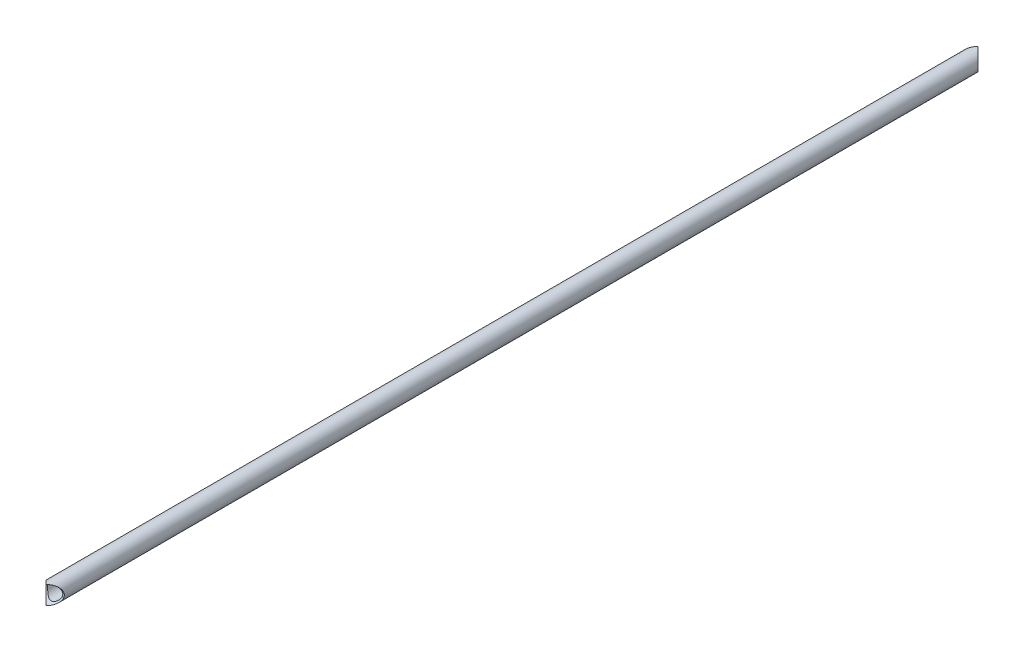
ISO-10303-21;
HEADER;
FILE_DESCRIPTION(('STEP AP214'),'2;1');
FILE_NAME('part.step','',(''),(''),'','','');
FILE_SCHEMA(('AUTOMOTIVE_DESIGN { 1 0 10303 214 1 1 1 1 }'));
ENDSEC;
DATA;
#1=APPLICATION_CONTEXT('core data for automotive mechanical design processes');
#2=APPLICATION_PROTOCOL_DEFINITION('international standard','automotive_design',2000,#1);
#3=PRODUCT_CONTEXT('',#1,'mechanical');
#4=PRODUCT('Part','Part','',(#3));
#5=PRODUCT_RELATED_PRODUCT_CATEGORY('part','',(#4));
#6=PRODUCT_DEFINITION_FORMATION('','',#4);
#7=PRODUCT_DEFINITION_CONTEXT('part definition',#1,'design');
#8=PRODUCT_DEFINITION('design','',#6,#7);
#9=PRODUCT_DEFINITION_SHAPE('','',#8);
#10=(LENGTH_UNIT() NAMED_UNIT(*) SI_UNIT(.MILLI.,.METRE.));
#11=(NAMED_UNIT(*) PLANE_ANGLE_UNIT() SI_UNIT($,.RADIAN.));
#12=(NAMED_UNIT(*) SI_UNIT($,.STERADIAN.) SOLID_ANGLE_UNIT());
#13=UNCERTAINTY_MEASURE_WITH_UNIT(LENGTH_MEASURE(1.E-05),#10,'distance_accuracy_value','');
#14=(GEOMETRIC_REPRESENTATION_CONTEXT(3) GLOBAL_UNCERTAINTY_ASSIGNED_CONTEXT((#13)) GLOBAL_UNIT_ASSIGNED_CONTEXT((#10,
#11,#12)) REPRESENTATION_CONTEXT('',''));
#15=CARTESIAN_POINT('',(0.,0.,0.));
#16=DIRECTION('',(0.,0.,1.));
#17=DIRECTION('',(1.,0.,0.));
#18=AXIS2_PLACEMENT_3D('',#15,#16,#17);
#19=CARTESIAN_POINT('',(-203.2,0.,2143.252));
#20=DIRECTION('',(-1.,0.,0.));
#21=DIRECTION('',(0.,0.,1.));
#22=AXIS2_PLACEMENT_3D('',#19,#20,#21);
#23=CYLINDRICAL_SURFACE('',#22,21.082);
#24=CARTESIAN_POINT('',(0.,0.,2143.252));
#25=DIRECTION('',(-0.707106781186549,0.,-0.707106781186546));
#26=DIRECTION('',(0.707106781186546,0.,-0.707106781186549));
#27=AXIS2_PLACEMENT_3D('',#24,#25,#26);
#28=ELLIPSE('',#27,29.8144503219495,21.082);
#29=CARTESIAN_POINT('',(0.,21.082,2143.252));
#30=VERTEX_POINT('',#29);
#31=CARTESIAN_POINT('',(0.,-21.082,2143.252));
#32=VERTEX_POINT('',#31);
#33=EDGE_CURVE('E36',#30,#32,#28,.T.);
#34=ORIENTED_EDGE('',*,*,#33,.F.);
#35=CARTESIAN_POINT('',(0.,0.,2143.252));
#36=DIRECTION('',(0.707106781186549,0.,-0.707106781186546));
#37=DIRECTION('',(-0.707106781186546,0.,-0.707106781186549));
#38=AXIS2_PLACEMENT_3D('',#35,#36,#37);
#39=ELLIPSE('',#38,29.8144503219495,21.082);
#40=EDGE_CURVE('E49',#32,#30,#39,.T.);
#41=ORIENTED_EDGE('',*,*,#40,.F.);
#42=EDGE_LOOP('',(#34,#41));
#43=FACE_BOUND('',#42,.T.);
#44=CARTESIAN_POINT('',(0.,-17.526,2131.53491640381));
#45=CARTESIAN_POINT('',(-0.311185239624755,-17.5260016378947,2131.53492057647));
#46=CARTESIAN_POINT('',(-0.622351445218545,-17.5176931015294,2131.52246304469));
#47=CARTESIAN_POINT('',(-1.24185385401228,-17.4846988539183,2131.47333724735));
#48=CARTESIAN_POINT('',(-1.55019015908706,-17.4600137345834,2131.43666985684));
#49=CARTESIAN_POINT('',(-2.16244529665251,-17.3948143787621,2131.34089229361));
#50=CARTESIAN_POINT('',(-2.46635032751227,-17.3542585500645,2131.28172316238));
#51=CARTESIAN_POINT('',(-3.06720718463186,-17.2582022882152,2131.14364625518));
#52=CARTESIAN_POINT('',(-3.36415774479987,-17.2026991564801,2131.06473491513));
#53=CARTESIAN_POINT('',(-4.06302745628092,-17.0535843130683,2130.85651458388));
#54=CARTESIAN_POINT('',(-4.46127907530082,-16.9535301925097,2130.71950458714));
#55=CARTESIAN_POINT('',(-5.2413407073691,-16.7288372054572,2130.42111585758));
#56=CARTESIAN_POINT('',(-5.62314297747671,-16.6041869119638,2130.25972580635));
#57=CARTESIAN_POINT('',(-6.37126683424926,-16.3317636320621,2129.9188861052));
#58=CARTESIAN_POINT('',(-6.73754662963654,-16.1839327090338,2129.73939161807));
#59=CARTESIAN_POINT('',(-7.45408327588804,-15.8666576854035,2129.36821169555));
#60=CARTESIAN_POINT('',(-7.80434067708931,-15.6972143279039,2129.17652667941));
#61=CARTESIAN_POINT('',(-8.64017899381091,-15.2583916209032,2128.69939510194));
#62=CARTESIAN_POINT('',(-9.11754391622324,-14.9778300302295,2128.40978137055));
#63=CARTESIAN_POINT('',(-10.0415160632166,-14.374735865823,2127.82493103364));
#64=CARTESIAN_POINT('',(-10.4881101794548,-14.0521855719282,2127.52969209931));
#65=CARTESIAN_POINT('',(-11.3497898907657,-13.3658527392674,2126.94222911673));
#66=CARTESIAN_POINT('',(-11.7649018003025,-13.0021052837984,2126.65000273099));
#67=CARTESIAN_POINT('',(-12.5623875794974,-12.2333003114351,2126.07564324607));
#68=CARTESIAN_POINT('',(-12.944773718712,-11.8282584025824,2125.79350638742));
#69=CARTESIAN_POINT('',(-13.5970346278617,-11.0669192234584,2125.30392467813));
#70=CARTESIAN_POINT('',(-13.8736134382399,-10.7183987975036,2125.09329140114));
#71=CARTESIAN_POINT('',(-14.4028407038531,-9.99596445975405,2124.6858117188));
#72=CARTESIAN_POINT('',(-14.6554900987945,-9.62205154611154,2124.48896477215));
#73=CARTESIAN_POINT('',(-15.1342035654355,-8.8500045327916,2124.11271286466));
#74=CARTESIAN_POINT('',(-15.3603025729126,-8.45190333226421,2123.93328503838));
#75=CARTESIAN_POINT('',(-15.7836038697298,-7.63224400398995,2123.59504177298));
#76=CARTESIAN_POINT('',(-15.9808113730435,-7.21069012767892,2123.43622261526));
#77=CARTESIAN_POINT('',(-16.3122154450185,-6.42051007803403,2123.16790984207));
#78=CARTESIAN_POINT('',(-16.4514151662288,-6.0552618741211,2123.05463133381));
#79=CARTESIAN_POINT('',(-16.7063464821851,-5.31159989558663,2122.84644574757));
#80=CARTESIAN_POINT('',(-16.8220825094071,-4.93318862342567,2122.75153519989));
#81=CARTESIAN_POINT('',(-17.0284767212217,-4.16529168273308,2122.58183750101));
#82=CARTESIAN_POINT('',(-17.1191435267946,-3.77580987215476,2122.50704343225));
#83=CARTESIAN_POINT('',(-17.2740554751118,-2.98810662755946,2122.37902377929));
#84=CARTESIAN_POINT('',(-17.3383003130948,-2.58988509279093,2122.32579844386));
#85=CARTESIAN_POINT('',(-17.4394973865413,-1.78589985576373,2122.24187595641));
#86=CARTESIAN_POINT('',(-17.4763337840664,-1.38011148961259,2122.21127442415));
#87=CARTESIAN_POINT('',(-17.5216078754302,-0.565854491198933,2122.17365492607));
#88=CARTESIAN_POINT('',(-17.5300455100714,-0.15738585335114,2122.1666370094));
#89=CARTESIAN_POINT('',(-17.5183673988472,0.658840305394934,2122.17634498303));
#90=CARTESIAN_POINT('',(-17.4982527387285,1.06659785274323,2122.19306997046));
#91=CARTESIAN_POINT('',(-17.4298388579758,1.87807893983295,2122.24988184256));
#92=CARTESIAN_POINT('',(-17.3815405868964,2.28180261501641,2122.28996794014));
#93=CARTESIAN_POINT('',(-17.2617419142674,3.05546264031595,2122.38919245349));
#94=CARTESIAN_POINT('',(-17.1919987114047,3.42586003012301,2122.44688606791));
#95=CARTESIAN_POINT('',(-17.0297069941817,4.15817336909846,2122.58079136849));
#96=CARTESIAN_POINT('',(-16.937159708176,4.5200897739503,2122.65700205721));
#97=CARTESIAN_POINT('',(-16.7304558932916,5.23359484929578,2122.82665503481));
#98=CARTESIAN_POINT('',(-16.6162960800062,5.58518194067378,2122.92009994268));
#99=CARTESIAN_POINT('',(-16.3677116370536,6.27643426134686,2123.12274637778));
#100=CARTESIAN_POINT('',(-16.2332858135048,6.61609878682287,2123.23194883328));
#101=CARTESIAN_POINT('',(-15.9331108592373,7.31109089686555,2123.4745988316));
#102=CARTESIAN_POINT('',(-15.765658679436,7.66523513049864,2123.60932608995));
#103=CARTESIAN_POINT('',(-15.4101996598829,8.35689209437833,2123.89346450325));
#104=CARTESIAN_POINT('',(-15.2221918600498,8.69440404672015,2124.04287634403));
#105=CARTESIAN_POINT('',(-14.8272083285566,9.35209844960755,2124.35434415863));
#106=CARTESIAN_POINT('',(-14.6202293775807,9.67227794419838,2124.51640227776));
#107=CARTESIAN_POINT('',(-14.1887580520627,10.2948186721717,2124.85112038901));
#108=CARTESIAN_POINT('',(-13.9642632148072,10.5971773894447,2125.02378187121));
#109=CARTESIAN_POINT('',(-13.4507289160126,11.2446849710491,2125.41443120589));
#110=CARTESIAN_POINT('',(-13.1579624545573,11.585694058529,2125.63439002879));
#111=CARTESIAN_POINT('',(-12.5504633562742,12.2411720036755,2126.08335766278));
#112=CARTESIAN_POINT('',(-12.2357274740967,12.5556369249829,2126.31236780877));
#113=CARTESIAN_POINT('',(-11.5850519846572,13.1584286905595,2126.77622069024));
#114=CARTESIAN_POINT('',(-11.2490806325735,13.4467147540311,2127.01107182361));
#115=CARTESIAN_POINT('',(-10.557107915642,13.9965511777058,2127.48246034144));
#116=CARTESIAN_POINT('',(-10.2011079065655,14.2581033442005,2127.71899761081));
#117=CARTESIAN_POINT('',(-9.4652181055698,14.7570366580728,2128.19211825249));
#118=CARTESIAN_POINT('',(-9.08510932065595,14.9941216137859,2128.42867374105));
#119=CARTESIAN_POINT('',(-8.30410846278523,15.4403622641035,2128.89408078949));
#120=CARTESIAN_POINT('',(-7.90321133245431,15.64951111776,2129.12293045216));
#121=CARTESIAN_POINT('',(-7.08063883642226,16.0384509266286,2129.56603839884));
#122=CARTESIAN_POINT('',(-6.65899996365621,16.2182912005025,2129.7803208339));
#123=CARTESIAN_POINT('',(-5.79353295482928,16.54719564434,2130.18642670967));
#124=CARTESIAN_POINT('',(-5.34971973229005,16.696280162227,2130.37826496278));
#125=CARTESIAN_POINT('',(-4.61599174217163,16.9096872269796,2130.66107392337));
#126=CARTESIAN_POINT('',(-4.33305990670602,16.9844727479109,2130.76233081244));
#127=CARTESIAN_POINT('',(-3.75910386380256,17.1206528131974,2130.94966833095));
#128=CARTESIAN_POINT('',(-3.46808258489758,17.1820521342226,2131.03575437178));
#129=CARTESIAN_POINT('',(-2.87925352198589,17.2904590721008,2131.18967756837));
#130=CARTESIAN_POINT('',(-2.58146156719823,17.3374971591084,2131.25755332314));
#131=CARTESIAN_POINT('',(-1.97986154206133,17.4164527674171,2131.3724888877));
#132=CARTESIAN_POINT('',(-1.67605364299667,17.4483707185722,2131.41954928924));
#133=CARTESIAN_POINT('',(-1.06142244679823,17.4965707933311,2131.49093551047));
#134=CARTESIAN_POINT('',(-0.750559438662828,17.5126944221406,2131.51503081352));
#135=CARTESIAN_POINT('',(-0.127486752535073,17.5283064038534,2131.5383581686));
#136=CARTESIAN_POINT('',(0.184722851397935,17.5277956602287,2131.53759157097));
#137=CARTESIAN_POINT('',(0.807835261309535,17.5101485211154,2131.51123067379));
#138=CARTESIAN_POINT('',(1.11873693105044,17.4929998394571,2131.48561802685));
#139=CARTESIAN_POINT('',(1.73636752581673,17.4425276727906,2131.41092947355));
#140=CARTESIAN_POINT('',(2.04309580438809,17.4092017106118,2131.36184997381));
#141=CARTESIAN_POINT('',(2.70129580173789,17.3202684324222,2131.23259244201));
#142=CARTESIAN_POINT('',(3.05163094171097,17.2618591297115,2131.14857598413));
#143=CARTESIAN_POINT('',(3.74168673817621,17.125544653635,2130.9564618039));
#144=CARTESIAN_POINT('',(4.08140475984641,17.0476346833835,2130.84835815718));
#145=CARTESIAN_POINT('',(4.75017183758834,16.8735380534471,2130.61254027511));
#146=CARTESIAN_POINT('',(5.07918889906025,16.7773015999041,2130.48477279803));
#147=CARTESIAN_POINT('',(5.72537291471272,16.5679251651736,2130.21421319313));
#148=CARTESIAN_POINT('',(6.04253907635785,16.4547840559982,2130.07142006289));
#149=CARTESIAN_POINT('',(6.84649854955802,16.1420461654977,2129.6882015848));
#150=CARTESIAN_POINT('',(7.32461540499281,15.9304484628452,2129.43931063567));
#151=CARTESIAN_POINT('',(8.25327584896681,15.4697427495779,2128.92519953056));
#152=CARTESIAN_POINT('',(8.70380408430281,15.2206141148922,2128.65997044409));
#153=CARTESIAN_POINT('',(9.57870297739579,14.6857838585868,2128.12181132487));
#154=CARTESIAN_POINT('',(10.0030396349771,14.4000361208072,2127.84887192597));
#155=CARTESIAN_POINT('',(10.8250002111717,13.7927902751819,2127.30281658318));
#156=CARTESIAN_POINT('',(11.2226293616248,13.4712992021975,2127.02970068452));
#157=CARTESIAN_POINT('',(12.0048882555962,12.7799006234573,2126.47918351307));
#158=CARTESIAN_POINT('',(12.3884749126378,12.4086316211082,2126.2020042632));
#159=CARTESIAN_POINT('',(13.1242664808958,11.6276478455587,2125.66011118268));
#160=CARTESIAN_POINT('',(13.4764660278002,11.2179265250181,2125.39539948646));
#161=CARTESIAN_POINT('',(14.1456465541962,10.3612672323298,2124.88510958517));
#162=CARTESIAN_POINT('',(14.4627101247532,9.91442105137353,2124.63948693374));
#163=CARTESIAN_POINT('',(14.9093724844699,9.21669876910963,2124.28964453539));
#164=CARTESIAN_POINT('',(15.0534199394609,8.97958368951592,2124.17614333907));
#165=CARTESIAN_POINT('',(15.3313920219187,8.4962827002655,2123.95603119063));
#166=CARTESIAN_POINT('',(15.4653142538036,8.25009466435488,2123.84942186994));
#167=CARTESIAN_POINT('',(15.7740353493856,7.64828647045894,2123.60261035176));
#168=CARTESIAN_POINT('',(15.9436374285181,7.28844211338054,2123.466122028));
#169=CARTESIAN_POINT('',(16.2597758929263,6.55290444190038,2123.21050018297));
#170=CARTESIAN_POINT('',(16.4063182437831,6.17721525857145,2123.09136217375));
#171=CARTESIAN_POINT('',(16.6744852599454,5.41170805813631,2122.87253727829));
#172=CARTESIAN_POINT('',(16.7961216056682,5.02189676543445,2122.7728412752));
#173=CARTESIAN_POINT('',(17.012789133161,4.23014401773285,2122.5947680549));
#174=CARTESIAN_POINT('',(17.1078196373129,3.82820225407366,2122.51639138068));
#175=CARTESIAN_POINT('',(17.2702087031939,3.01240280049619,2122.38221204066));
#176=CARTESIAN_POINT('',(17.3373944048852,2.59848725210803,2122.32655042127));
#177=CARTESIAN_POINT('',(17.4420303309739,1.7643465795862,2122.23977466753));
#178=CARTESIAN_POINT('',(17.4794806014798,1.34412146523731,2122.2086604951));
#179=CARTESIAN_POINT('',(17.5239199181906,0.501049558003906,2122.1717328222));
#180=CARTESIAN_POINT('',(17.5309162037693,0.0782034121150402,2122.1659133088));
#181=CARTESIAN_POINT('',(17.5143262226543,-0.766452841317653,2122.17970426579));
#182=CARTESIAN_POINT('',(17.4907419935961,-1.18826301601389,2122.19931304185));
#183=CARTESIAN_POINT('',(17.4170841881761,-1.98788490913943,2122.26046601728));
#184=CARTESIAN_POINT('',(17.3696960042557,-2.36612013468839,2122.29978579211));
#185=CARTESIAN_POINT('',(17.2509229834361,-3.11616450871018,2122.39814465942));
#186=CARTESIAN_POINT('',(17.1795399537179,-3.48797413891253,2122.45718226685));
#187=CARTESIAN_POINT('',(17.013794690207,-4.22296419237839,2122.59390075403));
#188=CARTESIAN_POINT('',(16.9194295314404,-4.58614351078497,2122.67158400683));
#189=CARTESIAN_POINT('',(16.7089637385301,-5.30192354415775,2122.84425885089));
#190=CARTESIAN_POINT('',(16.5928618601162,-5.65452365219928,2122.93925143297));
#191=CARTESIAN_POINT('',(16.3343025519062,-6.36399761707243,2123.14992039785));
#192=CARTESIAN_POINT('',(16.190857241763,-6.72028282825502,2123.26636337183));
#193=CARTESIAN_POINT('',(15.883236030154,-7.41814865422428,2123.51475089192));
#194=CARTESIAN_POINT('',(15.7190600747583,-7.75972923075431,2123.64669547837));
#195=CARTESIAN_POINT('',(15.3715416074323,-8.42721585313437,2123.92421185115));
#196=CARTESIAN_POINT('',(15.1881989812049,-8.7531218054946,2124.06978371874));
#197=CARTESIAN_POINT('',(14.8037894086192,-9.38863490224759,2124.37269293314));
#198=CARTESIAN_POINT('',(14.6027189316966,-9.69823878032626,2124.53003262259));
#199=CARTESIAN_POINT('',(14.0863757170533,-10.4414710002705,2124.9304731098));
#200=CARTESIAN_POINT('',(13.7616297139404,-10.8654797714761,2125.17930369519));
#201=CARTESIAN_POINT('',(13.0802149259049,-11.6768821386592,2125.69262064775));
#202=CARTESIAN_POINT('',(12.7235334230057,-12.0642610197643,2125.95711323782));
#203=CARTESIAN_POINT('',(11.9792953739003,-12.8036491868348,2126.49707118441));
#204=CARTESIAN_POINT('',(11.5916199606554,-13.1555093209754,2126.77257653929));
#205=CARTESIAN_POINT('',(10.7882226138889,-13.8219877892587,2127.32744923368));
#206=CARTESIAN_POINT('',(10.3725051599322,-14.1366120496172,2127.60681595072));
#207=CARTESIAN_POINT('',(9.50576680677194,-14.7337377450352,2128.16762418421));
#208=CARTESIAN_POINT('',(9.05424836320273,-15.0155658912321,2128.44901378704));
#209=CARTESIAN_POINT('',(8.12162517178224,-15.5398276170172,2129.00036827842));
#210=CARTESIAN_POINT('',(7.64050505920284,-15.782240496263,2129.270327109));
#211=CARTESIAN_POINT('',(6.89707752392845,-16.1140950182193,2129.65731316698));
#212=CARTESIAN_POINT('',(6.64623211980605,-16.2192180576644,2129.78305372928));
#213=CARTESIAN_POINT('',(6.13676732769517,-16.418760267264,2130.0270281082));
#214=CARTESIAN_POINT('',(5.87814733892529,-16.5131786075084,2130.14526134248));
#215=CARTESIAN_POINT('',(5.0909372652079,-16.7794342334219,2130.48548685745));
#216=CARTESIAN_POINT('',(4.55013693174708,-16.9346599661885,2130.69346683059));
#217=CARTESIAN_POINT('',(3.67633247278741,-17.1391936180727,2130.97539498441));
#218=CARTESIAN_POINT('',(3.35339503807153,-17.2054060883421,2131.06862094069));
#219=CARTESIAN_POINT('',(2.69865889204712,-17.3201691751224,2131.23233072331));
#220=CARTESIAN_POINT('',(2.3668620364875,-17.3687234597522,2131.30281927254));
#221=CARTESIAN_POINT('',(1.69770604668934,-17.4468189322611,2131.4171334776));
#222=CARTESIAN_POINT('',(1.36037183699502,-17.476429342286,2131.46105617427));
#223=CARTESIAN_POINT('',(0.68201714686959,-17.5160177178801,2131.51994349138));
#224=CARTESIAN_POINT('',(0.340997145591274,-17.5259982051931,2131.53491183142));
#225=CARTESIAN_POINT('',(0.,-17.526,2131.53491640381));
#226=B_SPLINE_CURVE_WITH_KNOTS('',3,(#44,#45,#46,#47,#48,#49,#50,#51,#52,#53,#54,#55,#56,#57,
#58,#59,#60,#61,#62,#63,#64,#65,#66,#67,#68,#69,#70,#71,#72,#73,#74,#75,#76,#77,#78,#79,#80,#81,
#82,#83,#84,#85,#86,#87,#88,#89,#90,#91,#92,#93,#94,#95,#96,#97,#98,#99,#100,#101,#102,#103,
#104,#105,#106,#107,#108,#109,#110,#111,#112,#113,#114,#115,#116,#117,#118,#119,#120,#121,#122,
#123,#124,#125,#126,#127,#128,#129,#130,#131,#132,#133,#134,#135,#136,#137,#138,#139,#140,#141,
#142,#143,#144,#145,#146,#147,#148,#149,#150,#151,#152,#153,#154,#155,#156,#157,#158,#159,#160,
#161,#162,#163,#164,#165,#166,#167,#168,#169,#170,#171,#172,#173,#174,#175,#176,#177,#178,#179,
#180,#181,#182,#183,#184,#185,#186,#187,#188,#189,#190,#191,#192,#193,#194,#195,#196,#197,#198,
#199,#200,#201,#202,#203,#204,#205,#206,#207,#208,#209,#210,#211,#212,#213,#214,#215,#216,#217,
#218,#219,#220,#221,#222,#223,#224,#225),.UNSPECIFIED.,.T.,.F.,(4,2,2,2,2,2,2,2,2,2,2,2,2,2,2,2,
2,2,2,2,2,2,2,2,2,2,2,2,2,2,2,2,2,2,2,2,2,2,2,2,2,2,2,2,2,2,2,2,2,2,2,2,2,2,2,2,2,2,2,2,2,2,2,2,
2,2,2,2,2,2,2,2,2,2,2,2,2,2,2,2,2,2,2,2,2,2,2,2,2,2,4),(0.,0.933172693022033,1.86631165953256,
2.80191264993146,3.73768266693524,5.03421487261744,6.33135085124964,7.63178208439832,
8.93216861675461,10.8043377121157,12.6772994813248,14.5486780714613,16.4193519416872,
17.8948685619842,19.3703272147969,20.8438221291614,22.3170507973488,23.53671968528,
24.7561579530498,25.9751763487712,27.1942088047281,28.4183645138435,29.6425227747186,
30.8666344862649,32.0907049577554,33.2333470618128,34.3759276302669,35.518681973679,
36.6615036636896,37.9030932180036,39.1447407874231,40.3865994501213,41.6286330324569,
43.1283930869268,44.6283751585668,46.1306551588406,47.6328335894826,49.1514688241534,
50.670475260672,52.1868986081186,53.7023154536194,54.6306896856113,55.5587320966308,
56.484791577948,57.4108247305145,58.3460581596759,59.2812407930625,60.2171145315852,
61.1531316224148,62.2463414280462,63.33982041241,64.4363139481779,65.5328806817876,
67.2674715330133,69.0030190806112,70.7407741677456,72.4781878402614,74.2806100835353,
76.0833397869962,77.8817378217744,78.7806894706808,79.6798531461853,80.9403031603003,
82.2004265563951,83.4599576194239,84.7195207582449,85.9867901712296,87.2540576191575,
88.5210238019553,89.7879055688293,90.9362330678387,92.0844740994958,93.2328613461462,
94.3813143497838,95.5841651482633,96.787019075977,97.989880177109,99.1929813757519,
100.958060446859,102.723845595494,104.496761581516,106.269395021408,108.073655659628,
109.878860830615,110.777431001181,111.676070788202,113.470212940669,114.496902002417,
115.523377668995,116.546080774989,117.568652491591),.UNSPECIFIED.);
#227=CARTESIAN_POINT('',(0.,-17.526,2131.53491640381));
#228=VERTEX_POINT('',#227);
#229=EDGE_CURVE('E10',#228,#228,#226,.F.);
#230=ORIENTED_EDGE('',*,*,#229,.F.);
#231=EDGE_LOOP('',(#230));
#232=FACE_BOUND('',#231,.T.);
#233=ADVANCED_FACE('F16',(#43,#232),#23,.F.);
#234=CARTESIAN_POINT('',(-203.2,0.,0.));
#235=DIRECTION('',(1.,0.,0.));
#236=DIRECTION('',(0.,1.,0.));
#237=AXIS2_PLACEMENT_3D('',#234,#235,#236);
#238=CYLINDRICAL_SURFACE('',#237,21.082);
#239=CARTESIAN_POINT('',(0.,0.,0.));
#240=DIRECTION('',(-0.707106781186548,0.,0.707106781186548));
#241=DIRECTION('',(0.707106781186548,0.,0.707106781186548));
#242=AXIS2_PLACEMENT_3D('',#239,#240,#241);
#243=ELLIPSE('',#242,29.8144503219496,21.082);
#244=CARTESIAN_POINT('',(0.,-21.082,0.));
#245=VERTEX_POINT('',#244);
#246=CARTESIAN_POINT('',(0.,21.082,0.));
#247=VERTEX_POINT('',#246);
#248=EDGE_CURVE('E44',#245,#247,#243,.T.);
#249=ORIENTED_EDGE('',*,*,#248,.F.);
#250=CARTESIAN_POINT('',(0.,0.,0.));
#251=DIRECTION('',(0.707106781186547,0.,0.707106781186548));
#252=DIRECTION('',(-0.707106781186548,0.,0.707106781186547));
#253=AXIS2_PLACEMENT_3D('',#250,#251,#252);
#254=ELLIPSE('',#253,29.8144503219496,21.082);
#255=EDGE_CURVE('E48',#247,#245,#254,.T.);
#256=ORIENTED_EDGE('',*,*,#255,.F.);
#257=EDGE_LOOP('',(#249,#256));
#258=FACE_BOUND('',#257,.T.);
#259=CARTESIAN_POINT('',(0.,17.526,11.7170835961855));
#260=CARTESIAN_POINT('',(-0.311185239624775,17.5260016378947,11.7170794235319));
#261=CARTESIAN_POINT('',(-0.62235144521858,17.5176931015294,11.7295369553151));
#262=CARTESIAN_POINT('',(-1.2418538540123,17.4846988539183,11.7786627526484));
#263=CARTESIAN_POINT('',(-1.55019015908706,17.4600137345834,11.8153301431635));
#264=CARTESIAN_POINT('',(-2.16244529665253,17.3948143787621,11.9111077063955));
#265=CARTESIAN_POINT('',(-2.46635032751232,17.3542585500645,11.970276837618));
#266=CARTESIAN_POINT('',(-3.06720718463191,17.2582022882152,12.1083537448172));
#267=CARTESIAN_POINT('',(-3.36415774479988,17.2026991564801,12.1872650848659));
#268=CARTESIAN_POINT('',(-4.06302745628094,17.0535843130683,12.3954854161195));
#269=CARTESIAN_POINT('',(-4.4612790753009,16.9535301925097,12.5324954128564));
#270=CARTESIAN_POINT('',(-5.24134070736924,16.7288372054571,12.8308841424232));
#271=CARTESIAN_POINT('',(-5.62314297747686,16.6041869119637,12.992274193646));
#272=CARTESIAN_POINT('',(-6.3712668342494,16.3317636320621,13.3331138948044));
#273=CARTESIAN_POINT('',(-6.73754662963669,16.1839327090337,13.5126083819292));
#274=CARTESIAN_POINT('',(-7.45408327588814,15.8666576854035,13.8837883044527));
#275=CARTESIAN_POINT('',(-7.80434067708937,15.6972143279038,14.0754733205898));
#276=CARTESIAN_POINT('',(-8.64017899381101,15.2583916209031,14.552604898062));
#277=CARTESIAN_POINT('',(-9.11754391622346,14.9778300302294,14.8422186294483));
#278=CARTESIAN_POINT('',(-10.0415160632169,14.3747358658228,15.427068966364));
#279=CARTESIAN_POINT('',(-10.488110179455,14.0521855719281,15.7223079006928));
#280=CARTESIAN_POINT('',(-11.3497898907658,13.3658527392673,16.3097708832751));
#281=CARTESIAN_POINT('',(-11.7649018003026,13.0021052837983,16.6019972690064));
#282=CARTESIAN_POINT('',(-12.5623875794975,12.233300311435,17.1763567539256));
#283=CARTESIAN_POINT('',(-12.9447737187121,11.8282584025823,17.4584936125817));
#284=CARTESIAN_POINT('',(-13.5970346278618,11.0669192234582,17.9480753218691));
#285=CARTESIAN_POINT('',(-13.8736134382401,10.7183987975033,18.1587085988652));
#286=CARTESIAN_POINT('',(-14.4028407038532,9.99596445975378,18.5661882812012));
#287=CARTESIAN_POINT('',(-14.6554900987947,9.62205154611133,18.7630352278501));
#288=CARTESIAN_POINT('',(-15.1342035654356,8.85000453279145,19.1392871353364));
#289=CARTESIAN_POINT('',(-15.3603025729126,8.45190333226405,19.3187149616181));
#290=CARTESIAN_POINT('',(-15.7836038697299,7.6322440039898,19.6569582270187));
#291=CARTESIAN_POINT('',(-15.9808113730436,7.21069012767878,19.8157773847372));
#292=CARTESIAN_POINT('',(-16.3122154450185,6.420510078034,20.0840901579273));
#293=CARTESIAN_POINT('',(-16.4514151662288,6.05526187412116,20.1973686661908));
#294=CARTESIAN_POINT('',(-16.706346482185,5.31159989558674,20.4055542524311));
#295=CARTESIAN_POINT('',(-16.822082509407,4.93318862342571,20.5004648001058));
#296=CARTESIAN_POINT('',(-17.0284767212217,4.16529168273308,20.6701624989867));
#297=CARTESIAN_POINT('',(-17.1191435267946,3.77580987215478,20.7449565677474));
#298=CARTESIAN_POINT('',(-17.2740554751118,2.98810662755949,20.8729762207129));
#299=CARTESIAN_POINT('',(-17.3383003130948,2.58988509279094,20.9262015561354));
#300=CARTESIAN_POINT('',(-17.4394973865413,1.78589985576376,21.0101240435934));
#301=CARTESIAN_POINT('',(-17.4763337840664,1.38011148961264,21.0407255758502));
#302=CARTESIAN_POINT('',(-17.5216078754302,0.565854491199007,21.0783450739343));
#303=CARTESIAN_POINT('',(-17.5300455100714,0.157385853351216,21.0853629906013));
#304=CARTESIAN_POINT('',(-17.5183673988472,-0.658840305394872,21.0756550169734));
#305=CARTESIAN_POINT('',(-17.4982527387285,-1.06659785274318,21.0589300295404));
#306=CARTESIAN_POINT('',(-17.4298388579758,-1.87807893983288,21.0021181574441));
#307=CARTESIAN_POINT('',(-17.3815405868964,-2.28180261501631,20.9620320598569));
#308=CARTESIAN_POINT('',(-17.2617419142674,-3.05546264031584,20.8628075465109));
#309=CARTESIAN_POINT('',(-17.1919987114047,-3.42586003012293,20.8051139320896));
#310=CARTESIAN_POINT('',(-17.0297069941817,-4.1581733690984,20.6712086315104));
#311=CARTESIAN_POINT('',(-16.937159708176,-4.52008977395024,20.5949979427882));
#312=CARTESIAN_POINT('',(-16.7304558932916,-5.23359484929571,20.4253449651873));
#313=CARTESIAN_POINT('',(-16.6162960800062,-5.58518194067371,20.3319000573192));
#314=CARTESIAN_POINT('',(-16.3677116370536,-6.27643426134678,20.1292536222194));
#315=CARTESIAN_POINT('',(-16.2332858135048,-6.61609878682278,20.0200511667184));
#316=CARTESIAN_POINT('',(-15.9331108592373,-7.31109089686549,19.7774011684013));
#317=CARTESIAN_POINT('',(-15.765658679436,-7.66523513049861,19.6426739100495));
#318=CARTESIAN_POINT('',(-15.4101996598829,-8.35689209437837,19.3585354967505));
#319=CARTESIAN_POINT('',(-15.2221918600498,-8.69440404672024,19.2091236559707));
#320=CARTESIAN_POINT('',(-14.8272083285566,-9.35209844960764,18.8976558413728));
#321=CARTESIAN_POINT('',(-14.6202293775806,-9.67227794419844,18.7355977222363));
#322=CARTESIAN_POINT('',(-14.1887580520627,-10.2948186721717,18.4008796109905));
#323=CARTESIAN_POINT('',(-13.9642632148072,-10.5971773894447,18.2282181287897));
#324=CARTESIAN_POINT('',(-13.4507289160127,-11.244684971049,17.8375687941069));
#325=CARTESIAN_POINT('',(-13.1579624545574,-11.5856940585288,17.6176099712067));
#326=CARTESIAN_POINT('',(-12.5504633562744,-12.2411720036753,17.1686423372183));
#327=CARTESIAN_POINT('',(-12.2357274740969,-12.5556369249827,16.9396321912341));
#328=CARTESIAN_POINT('',(-11.5850519846574,-13.1584286905594,16.4757793097621));
#329=CARTESIAN_POINT('',(-11.2490806325737,-13.446714754031,16.2409281763895));
#330=CARTESIAN_POINT('',(-10.5571079156421,-13.9965511777057,15.7695396585635));
#331=CARTESIAN_POINT('',(-10.2011079065657,-14.2581033442004,15.5330023891917));
#332=CARTESIAN_POINT('',(-9.46521810556997,-14.7570366580727,15.0598817475066));
#333=CARTESIAN_POINT('',(-9.08510932065603,-14.9941216137858,14.8233262589546));
#334=CARTESIAN_POINT('',(-8.30410846278524,-15.4403622641035,14.3579192105154));
#335=CARTESIAN_POINT('',(-7.90321133245436,-15.6495111177599,14.1290695478423));
#336=CARTESIAN_POINT('',(-7.08063883642227,-16.0384509266286,13.6859616011569));
#337=CARTESIAN_POINT('',(-6.65899996365616,-16.2182912005026,13.4716791661005));
#338=CARTESIAN_POINT('',(-5.79353295482919,-16.5471956443401,13.0655732903307));
#339=CARTESIAN_POINT('',(-5.34971973228997,-16.696280162227,12.8737350372167));
#340=CARTESIAN_POINT('',(-4.61599174217148,-16.9096872269796,12.5909260766296));
#341=CARTESIAN_POINT('',(-4.33305990670586,-16.9844727479109,12.4896691875633));
#342=CARTESIAN_POINT('',(-3.75910386380242,-17.1206528131974,12.3023316690525));
#343=CARTESIAN_POINT('',(-3.46808258489746,-17.1820521342226,12.2162456282212));
#344=CARTESIAN_POINT('',(-2.8792535219858,-17.2904590721008,12.0623224316295));
#345=CARTESIAN_POINT('',(-2.58146156719815,-17.3374971591084,11.9944466768579));
#346=CARTESIAN_POINT('',(-1.97986154206127,-17.4164527674171,11.8795111123051));
#347=CARTESIAN_POINT('',(-1.67605364299663,-17.4483707185722,11.8324507107617));
#348=CARTESIAN_POINT('',(-1.06142244679822,-17.4965707933311,11.7610644895283));
#349=CARTESIAN_POINT('',(-0.750559438662835,-17.5126944221406,11.7369691864769));
#350=CARTESIAN_POINT('',(-0.127486752535098,-17.5283064038534,11.7136418313979));
#351=CARTESIAN_POINT('',(0.184722851397903,-17.5277956602287,11.7144084290319));
#352=CARTESIAN_POINT('',(0.807835261309478,-17.5101485211154,11.7407693262134));
#353=CARTESIAN_POINT('',(1.11873693105037,-17.4929998394571,11.7663819731513));
#354=CARTESIAN_POINT('',(1.73636752581664,-17.4425276727906,11.8410705264514));
#355=CARTESIAN_POINT('',(2.043095804388,-17.4092017106118,11.8901500261935));
#356=CARTESIAN_POINT('',(2.7012958017378,-17.3202684324222,12.0194075579903));
#357=CARTESIAN_POINT('',(3.0516309417109,-17.2618591297115,12.1034240158727));
#358=CARTESIAN_POINT('',(3.74168673817613,-17.125544653635,12.2955381960971));
#359=CARTESIAN_POINT('',(4.08140475984633,-17.0476346833835,12.403641842824));
#360=CARTESIAN_POINT('',(4.75017183758827,-16.8735380534471,12.6394597248945));
#361=CARTESIAN_POINT('',(5.07918889906021,-16.7773015999041,12.7672272019709));
#362=CARTESIAN_POINT('',(5.72537291471269,-16.5679251651736,13.0377868068708));
#363=CARTESIAN_POINT('',(6.04253907635779,-16.4547840559982,13.1805799371149));
#364=CARTESIAN_POINT('',(6.8464985495579,-16.1420461654977,13.5637984152024));
#365=CARTESIAN_POINT('',(7.32461540499265,-15.9304484628453,13.8126893643339));
#366=CARTESIAN_POINT('',(8.2532758489666,-15.469742749578,14.3268004694395));
#367=CARTESIAN_POINT('',(8.70380408430258,-15.2206141148923,14.5920295559139));
#368=CARTESIAN_POINT('',(9.57870297739551,-14.685783858587,15.1301886751321));
#369=CARTESIAN_POINT('',(10.0030396349768,-14.4000361208074,15.4031280740317));
#370=CARTESIAN_POINT('',(10.8250002111714,-13.7927902751821,15.9491834168155));
#371=CARTESIAN_POINT('',(11.2226293616245,-13.4712992021977,16.2222993154787));
#372=CARTESIAN_POINT('',(12.0048882555959,-12.7799006234576,16.7728164869347));
#373=CARTESIAN_POINT('',(12.3884749126374,-12.4086316211085,17.0499957368036));
#374=CARTESIAN_POINT('',(13.1242664808955,-11.6276478455591,17.5918888173235));
#375=CARTESIAN_POINT('',(13.4764660277999,-11.2179265250184,17.8566005135371));
#376=CARTESIAN_POINT('',(14.145646554196,-10.3612672323301,18.3668904148319));
#377=CARTESIAN_POINT('',(14.4627101247529,-9.91442105137385,18.6125130662574));
#378=CARTESIAN_POINT('',(14.9093724844698,-9.21669876910987,18.9623554646115));
#379=CARTESIAN_POINT('',(15.0534199394608,-8.97958368951614,19.0758566609265));
#380=CARTESIAN_POINT('',(15.3313920219185,-8.49628270026577,19.2959688093742));
#381=CARTESIAN_POINT('',(15.4653142538034,-8.25009466435524,19.4025781300609));
#382=CARTESIAN_POINT('',(15.7740353493854,-7.64828647045938,19.64938964824));
#383=CARTESIAN_POINT('',(15.9436374285179,-7.28844211338093,19.7858779719994));
#384=CARTESIAN_POINT('',(16.2597758929261,-6.55290444190075,20.0414998170308));
#385=CARTESIAN_POINT('',(16.4063182437829,-6.17721525857184,20.1606378262551));
#386=CARTESIAN_POINT('',(16.6744852599453,-5.41170805813668,20.3794627217077));
#387=CARTESIAN_POINT('',(16.7961216056681,-5.02189676543479,20.4791587247984));
#388=CARTESIAN_POINT('',(17.012789133161,-4.23014401773315,20.6572319450956));
#389=CARTESIAN_POINT('',(17.1078196373129,-3.82820225407398,20.7356086193235));
#390=CARTESIAN_POINT('',(17.2702087031939,-3.01240280049653,20.8697879593399));
#391=CARTESIAN_POINT('',(17.3373944048851,-2.59848725210838,20.9254495787255));
#392=CARTESIAN_POINT('',(17.4420303309739,-1.76434657958656,21.0122253324729));
#393=CARTESIAN_POINT('',(17.4794806014797,-1.34412146523765,21.0433395048985));
#394=CARTESIAN_POINT('',(17.5239199181906,-0.501049558004232,21.0802671778015));
#395=CARTESIAN_POINT('',(17.5309162037693,-0.0782034121153581,21.0860866912022));
#396=CARTESIAN_POINT('',(17.5143262226544,0.76645284131734,21.0722957342077));
#397=CARTESIAN_POINT('',(17.4907419935961,1.18826301601358,21.0526869581457));
#398=CARTESIAN_POINT('',(17.4170841881761,1.98788490913912,20.9915339827169));
#399=CARTESIAN_POINT('',(17.3696960042558,2.36612013468808,20.9522142078891));
#400=CARTESIAN_POINT('',(17.2509229834362,3.11616450870987,20.8538553405763));
#401=CARTESIAN_POINT('',(17.1795399537179,3.4879741389122,20.7948177331495));
#402=CARTESIAN_POINT('',(17.0137946902071,4.22296419237806,20.6580992459665));
#403=CARTESIAN_POINT('',(16.9194295314405,4.58614351078466,20.580415993166));
#404=CARTESIAN_POINT('',(16.7089637385302,5.30192354415746,20.4077411491116));
#405=CARTESIAN_POINT('',(16.5928618601163,5.65452365219899,20.3127485670318));
#406=CARTESIAN_POINT('',(16.3343025519063,6.36399761707216,20.1020796021486));
#407=CARTESIAN_POINT('',(16.1908572417631,6.72028282825475,19.985636628175));
#408=CARTESIAN_POINT('',(15.8832360301541,7.41814865422397,19.7372491080794));
#409=CARTESIAN_POINT('',(15.7190600747585,7.75972923075395,19.6053045216306));
#410=CARTESIAN_POINT('',(15.3715416074325,8.42721585313399,19.3277881488529));
#411=CARTESIAN_POINT('',(15.1881989812051,8.75312180549423,19.1822162812606));
#412=CARTESIAN_POINT('',(14.8037894086194,9.38863490224725,18.8793070668651));
#413=CARTESIAN_POINT('',(14.6027189316968,9.69823878032591,18.7219673774091));
#414=CARTESIAN_POINT('',(14.0863757170536,10.4414710002701,18.3215268901985));
#415=CARTESIAN_POINT('',(13.7616297139406,10.8654797714758,18.0726963048078));
#416=CARTESIAN_POINT('',(13.0802149259052,11.676882138659,17.5593793522509));
#417=CARTESIAN_POINT('',(12.723533423006,12.064261019764,17.2948867621829));
#418=CARTESIAN_POINT('',(11.9792953739005,12.8036491868346,16.7549288155896));
#419=CARTESIAN_POINT('',(11.5916199606556,13.1555093209753,16.479423460715));
#420=CARTESIAN_POINT('',(10.7882226138891,13.8219877892586,15.9245507663207));
#421=CARTESIAN_POINT('',(10.3725051599325,14.136612049617,15.6451840492753));
#422=CARTESIAN_POINT('',(9.5057668067723,14.7337377450349,15.0843758157883));
#423=CARTESIAN_POINT('',(9.05424836320313,15.0155658912319,14.8029862129606));
#424=CARTESIAN_POINT('',(8.12162517178263,15.539827617017,14.2516317215844));
#425=CARTESIAN_POINT('',(7.64050505920317,15.7822404962628,13.9816728910043));
#426=CARTESIAN_POINT('',(6.89707752392883,16.1140950182191,13.5946868330229));
#427=CARTESIAN_POINT('',(6.64623211980643,16.2192180576643,13.4689462707243));
#428=CARTESIAN_POINT('',(6.13676732769553,16.4187602672639,13.2249718918047));
#429=CARTESIAN_POINT('',(5.87814733892561,16.5131786075083,13.1067386575212));
#430=CARTESIAN_POINT('',(5.0909372652082,16.7794342334218,12.7665131425477));
#431=CARTESIAN_POINT('',(4.55013693174743,16.9346599661884,12.5585331694056));
#432=CARTESIAN_POINT('',(3.67633247278776,17.1391936180726,12.2766050155908));
#433=CARTESIAN_POINT('',(3.35339503807183,17.205406088342,12.1833790593107));
#434=CARTESIAN_POINT('',(2.69865889204733,17.3201691751224,12.0196692766856));
#435=CARTESIAN_POINT('',(2.36686203648766,17.3687234597521,11.9491807274641));
#436=CARTESIAN_POINT('',(1.69770604668941,17.4468189322611,11.834866522402));
#437=CARTESIAN_POINT('',(1.36037183699506,17.476429342286,11.7909438257341));
#438=CARTESIAN_POINT('',(0.682017146869595,17.5160177178801,11.7320565086233));
#439=CARTESIAN_POINT('',(0.340997145591274,17.5259982051931,11.7170881685842));
#440=CARTESIAN_POINT('',(0.,17.526,11.7170835961855));
#441=B_SPLINE_CURVE_WITH_KNOTS('',3,(#259,#260,#261,#262,#263,#264,#265,#266,#267,#268,#269,
#270,#271,#272,#273,#274,#275,#276,#277,#278,#279,#280,#281,#282,#283,#284,#285,#286,#287,#288,
#289,#290,#291,#292,#293,#294,#295,#296,#297,#298,#299,#300,#301,#302,#303,#304,#305,#306,#307,
#308,#309,#310,#311,#312,#313,#314,#315,#316,#317,#318,#319,#320,#321,#322,#323,#324,#325,#326,
#327,#328,#329,#330,#331,#332,#333,#334,#335,#336,#337,#338,#339,#340,#341,#342,#343,#344,#345,
#346,#347,#348,#349,#350,#351,#352,#353,#354,#355,#356,#357,#358,#359,#360,#361,#362,#363,#364,
#365,#366,#367,#368,#369,#370,#371,#372,#373,#374,#375,#376,#377,#378,#379,#380,#381,#382,#383,
#384,#385,#386,#387,#388,#389,#390,#391,#392,#393,#394,#395,#396,#397,#398,#399,#400,#401,#402,
#403,#404,#405,#406,#407,#408,#409,#410,#411,#412,#413,#414,#415,#416,#417,#418,#419,#420,#421,
#422,#423,#424,#425,#426,#427,#428,#429,#430,#431,#432,#433,#434,#435,#436,#437,#438,#439,#440),
.UNSPECIFIED.,.T.,.F.,(4,2,2,2,2,2,2,2,2,2,2,2,2,2,2,2,2,2,2,2,2,2,2,2,2,2,2,2,2,2,2,2,2,2,2,2,
2,2,2,2,2,2,2,2,2,2,2,2,2,2,2,2,2,2,2,2,2,2,2,2,2,2,2,2,2,2,2,2,2,2,2,2,2,2,2,2,2,2,2,2,2,2,2,2,
2,2,2,2,2,2,4),(0.,0.933172693022054,1.8663116595326,2.80191264993148,3.73768266693524,
5.03421487261754,6.33135085124986,7.63178208439845,8.93216861675471,10.8043377121159,
12.6772994813249,14.5486780714615,16.4193519416874,17.8948685619845,19.3703272147972,
20.8438221291614,22.3170507973489,23.5367196852798,24.7561579530497,25.9751763487712,
27.1942088047281,28.4183645138434,29.6425227747185,30.8666344862649,32.0907049577553,
33.2333470618126,34.3759276302668,35.5186819736788,36.6615036636894,37.9030932180036,
39.1447407874231,40.3865994501214,41.6286330324567,43.1283930869264,44.6283751585665,
46.1306551588403,47.6328335894824,49.1514688241532,50.670475260672,52.1868986081185,
53.7023154536196,54.6306896856113,55.5587320966309,56.4847915779479,57.4108247305144,
58.3460581596758,59.2812407930624,60.2171145315851,61.1531316224146,62.246341428046,
63.3398204124099,64.4363139481779,65.5328806817875,67.2674715330129,69.0030190806109,
70.7407741677449,72.4781878402609,74.2806100835346,76.0833397869957,77.8817378217741,
78.7806894706805,79.6798531461849,80.9403031602998,82.2004265563946,83.4599576194235,
84.7195207582446,85.9867901712292,87.2540576191571,88.521023801955,89.787905568829,
90.9362330678383,92.0844740994954,93.2328613461459,94.3813143497834,95.5841651482628,
96.7870190759766,97.9898801771086,99.1929813757516,100.958060446859,102.723845595493,
104.496761581516,106.269395021408,108.073655659627,109.878860830614,110.77743100118,
111.676070788202,113.470212940669,114.496902002416,115.523377668995,116.546080774989,
117.568652491591),.UNSPECIFIED.);
#442=CARTESIAN_POINT('',(0.,17.526,11.7170835961855));
#443=VERTEX_POINT('',#442);
#444=EDGE_CURVE('E21',#443,#443,#441,.F.);
#445=ORIENTED_EDGE('',*,*,#444,.F.);
#446=EDGE_LOOP('',(#445));
#447=FACE_BOUND('',#446,.T.);
#448=ADVANCED_FACE('F51',(#258,#447),#238,.F.);
#449=CARTESIAN_POINT('',(0.,0.,0.));
#450=DIRECTION('',(0.,0.,1.));
#451=DIRECTION('',(1.,0.,0.));
#452=AXIS2_PLACEMENT_3D('',#449,#450,#451);
#453=CYLINDRICAL_SURFACE('',#452,17.526);
#454=ORIENTED_EDGE('',*,*,#229,.T.);
#455=EDGE_LOOP('',(#454));
#456=FACE_BOUND('',#455,.T.);
#457=ORIENTED_EDGE('',*,*,#444,.T.);
#458=EDGE_LOOP('',(#457));
#459=FACE_BOUND('',#458,.T.);
#460=ADVANCED_FACE('F18',(#456,#459),#453,.F.);
#461=CARTESIAN_POINT('',(0.,0.,0.));
#462=DIRECTION('',(0.,0.,1.));
#463=DIRECTION('',(1.,0.,0.));
#464=AXIS2_PLACEMENT_3D('',#461,#462,#463);
#465=CYLINDRICAL_SURFACE('',#464,21.082);
#466=ORIENTED_EDGE('',*,*,#33,.T.);
#467=ORIENTED_EDGE('',*,*,#40,.T.);
#468=EDGE_LOOP('',(#466,#467));
#469=FACE_BOUND('',#468,.T.);
#470=ORIENTED_EDGE('',*,*,#248,.T.);
#471=ORIENTED_EDGE('',*,*,#255,.T.);
#472=EDGE_LOOP('',(#470,#471));
#473=FACE_BOUND('',#472,.T.);
#474=ADVANCED_FACE('F47',(#469,#473),#465,.T.);
#475=CLOSED_SHELL('',(#233,#448,#460,#474));
#476=MANIFOLD_SOLID_BREP('B1',#475);
#477=ADVANCED_BREP_SHAPE_REPRESENTATION('',(#18,#476),#14);
#478=SHAPE_DEFINITION_REPRESENTATION(#9,#477);
ENDSEC;
END-ISO-10303-21;
